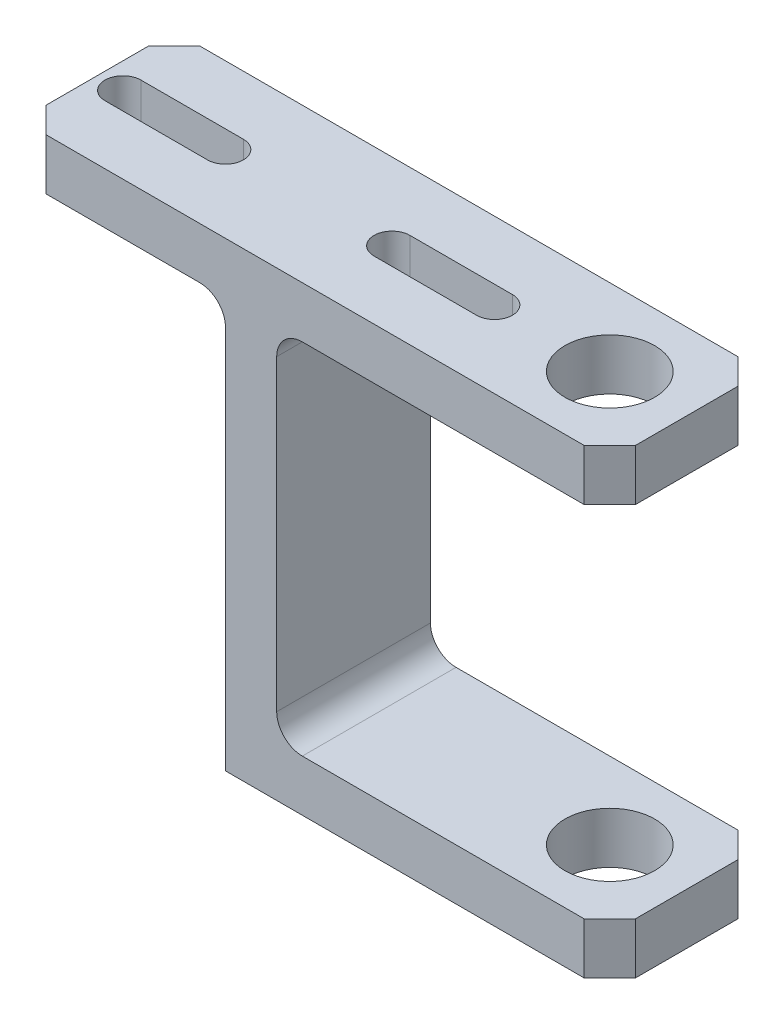
ISO-10303-21;
HEADER;
FILE_DESCRIPTION(('STEP AP214'),'2;1');
FILE_NAME('part.step','',(''),(''),'','','');
FILE_SCHEMA(('AUTOMOTIVE_DESIGN { 1 0 10303 214 1 1 1 1 }'));
ENDSEC;
DATA;
#1=APPLICATION_CONTEXT('core data for automotive mechanical design processes');
#2=APPLICATION_PROTOCOL_DEFINITION('international standard','automotive_design',2000,#1);
#3=PRODUCT_CONTEXT('',#1,'mechanical');
#4=PRODUCT('Part','Part','',(#3));
#5=PRODUCT_RELATED_PRODUCT_CATEGORY('part','',(#4));
#6=PRODUCT_DEFINITION_FORMATION('','',#4);
#7=PRODUCT_DEFINITION_CONTEXT('part definition',#1,'design');
#8=PRODUCT_DEFINITION('design','',#6,#7);
#9=PRODUCT_DEFINITION_SHAPE('','',#8);
#10=(LENGTH_UNIT() NAMED_UNIT(*) SI_UNIT(.MILLI.,.METRE.));
#11=(NAMED_UNIT(*) PLANE_ANGLE_UNIT() SI_UNIT($,.RADIAN.));
#12=(NAMED_UNIT(*) SI_UNIT($,.STERADIAN.) SOLID_ANGLE_UNIT());
#13=UNCERTAINTY_MEASURE_WITH_UNIT(LENGTH_MEASURE(1.E-05),#10,'distance_accuracy_value','');
#14=(GEOMETRIC_REPRESENTATION_CONTEXT(3) GLOBAL_UNCERTAINTY_ASSIGNED_CONTEXT((#13)) GLOBAL_UNIT_ASSIGNED_CONTEXT((#10,
#11,#12)) REPRESENTATION_CONTEXT('',''));
#15=CARTESIAN_POINT('',(0.,0.,0.));
#16=DIRECTION('',(0.,0.,1.));
#17=DIRECTION('',(1.,0.,0.));
#18=AXIS2_PLACEMENT_3D('',#15,#16,#17);
#19=CARTESIAN_POINT('',(150.,180.,30.));
#20=DIRECTION('',(0.,-1.,0.));
#21=DIRECTION('',(1.,0.,0.));
#22=AXIS2_PLACEMENT_3D('',#19,#20,#21);
#23=PLANE('',#22);
#24=DIRECTION('',(1.,0.,0.));
#25=VECTOR('',#24,1.);
#26=CARTESIAN_POINT('',(35.,180.,7.));
#27=LINE('',#26,#25);
#28=CARTESIAN_POINT('',(35.,180.,7.00000000000001));
#29=VERTEX_POINT('',#28);
#30=CARTESIAN_POINT('',(75.,180.,7.));
#31=VERTEX_POINT('',#30);
#32=EDGE_CURVE('E239',#29,#31,#27,.T.);
#33=ORIENTED_EDGE('',*,*,#32,.F.);
#34=CARTESIAN_POINT('',(35.,180.,0.));
#35=DIRECTION('',(0.,1.,0.));
#36=DIRECTION('',(-1.,0.,0.));
#37=AXIS2_PLACEMENT_3D('',#34,#35,#36);
#38=CIRCLE('',#37,7.);
#39=CARTESIAN_POINT('',(35.,180.,-6.99999999999999));
#40=VERTEX_POINT('',#39);
#41=EDGE_CURVE('E60',#40,#29,#38,.T.);
#42=ORIENTED_EDGE('',*,*,#41,.F.);
#43=DIRECTION('',(-1.,0.,0.));
#44=VECTOR('',#43,1.);
#45=CARTESIAN_POINT('',(75.,180.,-6.99999999999999));
#46=LINE('',#45,#44);
#47=CARTESIAN_POINT('',(75.,180.,-6.99999999999999));
#48=VERTEX_POINT('',#47);
#49=EDGE_CURVE('E243',#48,#40,#46,.T.);
#50=ORIENTED_EDGE('',*,*,#49,.F.);
#51=CARTESIAN_POINT('',(75.,180.,0.));
#52=DIRECTION('',(0.,-1.,0.));
#53=DIRECTION('',(1.,0.,0.));
#54=AXIS2_PLACEMENT_3D('',#51,#52,#53);
#55=CIRCLE('',#54,7.);
#56=EDGE_CURVE('E228',#48,#31,#55,.T.);
#57=ORIENTED_EDGE('',*,*,#56,.T.);
#58=EDGE_LOOP('',(#33,#42,#50,#57));
#59=FACE_BOUND('',#58,.T.);
#60=DIRECTION('',(-1.,0.,0.));
#61=VECTOR('',#60,1.);
#62=CARTESIAN_POINT('',(150.,180.,-30.));
#63=LINE('',#62,#61);
#64=CARTESIAN_POINT('',(140.,180.,-30.));
#65=VERTEX_POINT('',#64);
#66=CARTESIAN_POINT('',(-70.,180.,-30.));
#67=VERTEX_POINT('',#66);
#68=EDGE_CURVE('E529',#65,#67,#63,.T.);
#69=ORIENTED_EDGE('',*,*,#68,.T.);
#70=DIRECTION('',(0.70710678118655,0.,-0.707106781186546));
#71=VECTOR('',#70,1.);
#72=CARTESIAN_POINT('',(-80.,180.,-20.));
#73=LINE('',#72,#71);
#74=CARTESIAN_POINT('',(-80.,180.,-20.));
#75=VERTEX_POINT('',#74);
#76=EDGE_CURVE('E489',#67,#75,#73,.F.);
#77=ORIENTED_EDGE('',*,*,#76,.T.);
#78=DIRECTION('',(0.,0.,-1.));
#79=VECTOR('',#78,1.);
#80=CARTESIAN_POINT('',(-80.,180.,30.));
#81=LINE('',#80,#79);
#82=CARTESIAN_POINT('',(-80.,180.,20.));
#83=VERTEX_POINT('',#82);
#84=EDGE_CURVE('E452',#83,#75,#81,.T.);
#85=ORIENTED_EDGE('',*,*,#84,.F.);
#86=DIRECTION('',(0.707106781186546,0.,0.707106781186549));
#87=VECTOR('',#86,1.);
#88=CARTESIAN_POINT('',(-70.0000000000001,180.,30.));
#89=LINE('',#88,#87);
#90=CARTESIAN_POINT('',(-70.0000000000001,180.,30.));
#91=VERTEX_POINT('',#90);
#92=EDGE_CURVE('E488',#83,#91,#89,.T.);
#93=ORIENTED_EDGE('',*,*,#92,.T.);
#94=DIRECTION('',(-1.,0.,0.));
#95=VECTOR('',#94,1.);
#96=CARTESIAN_POINT('',(150.,180.,30.));
#97=LINE('',#96,#95);
#98=CARTESIAN_POINT('',(140.,180.,30.));
#99=VERTEX_POINT('',#98);
#100=EDGE_CURVE('E586',#99,#91,#97,.T.);
#101=ORIENTED_EDGE('',*,*,#100,.F.);
#102=DIRECTION('',(0.707106781186548,0.,-0.707106781186548));
#103=VECTOR('',#102,1.);
#104=CARTESIAN_POINT('',(140.,180.,30.));
#105=LINE('',#104,#103);
#106=CARTESIAN_POINT('',(150.,180.,20.));
#107=VERTEX_POINT('',#106);
#108=EDGE_CURVE('E463',#99,#107,#105,.T.);
#109=ORIENTED_EDGE('',*,*,#108,.T.);
#110=DIRECTION('',(0.,0.,-1.));
#111=VECTOR('',#110,1.);
#112=CARTESIAN_POINT('',(150.,180.,30.));
#113=LINE('',#112,#111);
#114=CARTESIAN_POINT('',(150.,180.,-20.));
#115=VERTEX_POINT('',#114);
#116=EDGE_CURVE('E443',#107,#115,#113,.T.);
#117=ORIENTED_EDGE('',*,*,#116,.T.);
#118=DIRECTION('',(0.707106781186549,0.,0.707106781186547));
#119=VECTOR('',#118,1.);
#120=CARTESIAN_POINT('',(150.,180.,-20.));
#121=LINE('',#120,#119);
#122=EDGE_CURVE('E486',#115,#65,#121,.F.);
#123=ORIENTED_EDGE('',*,*,#122,.T.);
#124=EDGE_LOOP('',(#69,#77,#85,#93,#101,#109,#117,#123));
#125=FACE_BOUND('',#124,.T.);
#126=CARTESIAN_POINT('',(120.,180.,0.));
#127=DIRECTION('',(0.,1.,0.));
#128=DIRECTION('',(-1.,0.,0.));
#129=AXIS2_PLACEMENT_3D('',#126,#127,#128);
#130=CIRCLE('',#129,17.5);
#131=CARTESIAN_POINT('',(102.5,180.,0.));
#132=VERTEX_POINT('',#131);
#133=EDGE_CURVE('E265',#132,#132,#130,.T.);
#134=ORIENTED_EDGE('',*,*,#133,.F.);
#135=EDGE_LOOP('',(#134));
#136=FACE_BOUND('',#135,.T.);
#137=CARTESIAN_POINT('',(-30.,180.,0.));
#138=DIRECTION('',(0.,1.,0.));
#139=DIRECTION('',(-1.,0.,0.));
#140=AXIS2_PLACEMENT_3D('',#137,#138,#139);
#141=CIRCLE('',#140,7.);
#142=CARTESIAN_POINT('',(-30.,180.,-7.));
#143=VERTEX_POINT('',#142);
#144=CARTESIAN_POINT('',(-30.,180.,7.));
#145=VERTEX_POINT('',#144);
#146=EDGE_CURVE('E263',#143,#145,#141,.F.);
#147=ORIENTED_EDGE('',*,*,#146,.T.);
#148=DIRECTION('',(1.,0.,0.));
#149=VECTOR('',#148,1.);
#150=CARTESIAN_POINT('',(0.,180.,7.));
#151=LINE('',#150,#149);
#152=CARTESIAN_POINT('',(-70.,180.,7.));
#153=VERTEX_POINT('',#152);
#154=EDGE_CURVE('E614',#153,#145,#151,.T.);
#155=ORIENTED_EDGE('',*,*,#154,.F.);
#156=CARTESIAN_POINT('',(-70.,180.,0.));
#157=DIRECTION('',(0.,1.,0.));
#158=DIRECTION('',(-1.,0.,0.));
#159=AXIS2_PLACEMENT_3D('',#156,#157,#158);
#160=CIRCLE('',#159,7.);
#161=CARTESIAN_POINT('',(-70.,180.,-6.99999999999999));
#162=VERTEX_POINT('',#161);
#163=EDGE_CURVE('E620',#162,#153,#160,.T.);
#164=ORIENTED_EDGE('',*,*,#163,.F.);
#165=DIRECTION('',(-1.,0.,0.));
#166=VECTOR('',#165,1.);
#167=CARTESIAN_POINT('',(0.,180.,-7.00000000000001));
#168=LINE('',#167,#166);
#169=EDGE_CURVE('E625',#143,#162,#168,.T.);
#170=ORIENTED_EDGE('',*,*,#169,.F.);
#171=EDGE_LOOP('',(#147,#155,#164,#170));
#172=FACE_BOUND('',#171,.T.);
#173=ADVANCED_FACE('F41',(#59,#125,#136,#172),#23,.F.);
#174=CARTESIAN_POINT('',(-80.,160.,30.));
#175=DIRECTION('',(0.,1.,0.));
#176=DIRECTION('',(0.,0.,1.));
#177=AXIS2_PLACEMENT_3D('',#174,#175,#176);
#178=PLANE('',#177);
#179=DIRECTION('',(0.,0.,-1.));
#180=VECTOR('',#179,1.);
#181=CARTESIAN_POINT('',(-80.,160.,30.));
#182=LINE('',#181,#180);
#183=CARTESIAN_POINT('',(-80.,160.,20.));
#184=VERTEX_POINT('',#183);
#185=CARTESIAN_POINT('',(-80.,160.,-20.));
#186=VERTEX_POINT('',#185);
#187=EDGE_CURVE('E455',#184,#186,#182,.T.);
#188=ORIENTED_EDGE('',*,*,#187,.T.);
#189=DIRECTION('',(-0.70710678118655,0.,0.707106781186546));
#190=VECTOR('',#189,1.);
#191=CARTESIAN_POINT('',(-80.,160.,-20.));
#192=LINE('',#191,#190);
#193=CARTESIAN_POINT('',(-70.,160.,-30.));
#194=VERTEX_POINT('',#193);
#195=EDGE_CURVE('E479',#186,#194,#192,.F.);
#196=ORIENTED_EDGE('',*,*,#195,.T.);
#197=DIRECTION('',(1.,0.,0.));
#198=VECTOR('',#197,1.);
#199=CARTESIAN_POINT('',(-80.,160.,-30.));
#200=LINE('',#199,#198);
#201=CARTESIAN_POINT('',(-10.0000000000001,160.,-30.));
#202=VERTEX_POINT('',#201);
#203=EDGE_CURVE('E570',#194,#202,#200,.T.);
#204=ORIENTED_EDGE('',*,*,#203,.T.);
#205=DIRECTION('',(0.,0.,-1.));
#206=VECTOR('',#205,1.);
#207=CARTESIAN_POINT('',(-10.0000000000001,160.,30.));
#208=LINE('',#207,#206);
#209=CARTESIAN_POINT('',(-10.0000000000001,160.,30.));
#210=VERTEX_POINT('',#209);
#211=EDGE_CURVE('E456',#210,#202,#208,.T.);
#212=ORIENTED_EDGE('',*,*,#211,.F.);
#213=DIRECTION('',(1.,0.,0.));
#214=VECTOR('',#213,1.);
#215=CARTESIAN_POINT('',(-80.,160.,30.));
#216=LINE('',#215,#214);
#217=CARTESIAN_POINT('',(-70.0000000000001,160.,30.));
#218=VERTEX_POINT('',#217);
#219=EDGE_CURVE('E582',#218,#210,#216,.T.);
#220=ORIENTED_EDGE('',*,*,#219,.F.);
#221=DIRECTION('',(-0.707106781186546,0.,-0.707106781186549));
#222=VECTOR('',#221,1.);
#223=CARTESIAN_POINT('',(-70.0000000000001,160.,30.));
#224=LINE('',#223,#222);
#225=EDGE_CURVE('E480',#218,#184,#224,.T.);
#226=ORIENTED_EDGE('',*,*,#225,.T.);
#227=EDGE_LOOP('',(#188,#196,#204,#212,#220,#226));
#228=FACE_BOUND('',#227,.T.);
#229=CARTESIAN_POINT('',(-30.,160.,0.));
#230=DIRECTION('',(0.,1.,0.));
#231=DIRECTION('',(0.,0.,1.));
#232=AXIS2_PLACEMENT_3D('',#229,#230,#231);
#233=CIRCLE('',#232,7.);
#234=CARTESIAN_POINT('',(-30.,160.,-7.));
#235=VERTEX_POINT('',#234);
#236=CARTESIAN_POINT('',(-30.,160.,7.));
#237=VERTEX_POINT('',#236);
#238=EDGE_CURVE('E423',#235,#237,#233,.F.);
#239=ORIENTED_EDGE('',*,*,#238,.F.);
#240=DIRECTION('',(-1.,0.,0.));
#241=VECTOR('',#240,1.);
#242=CARTESIAN_POINT('',(-80.,160.,-6.99999999999999));
#243=LINE('',#242,#241);
#244=CARTESIAN_POINT('',(-70.,160.,-6.99999999999999));
#245=VERTEX_POINT('',#244);
#246=EDGE_CURVE('E412',#235,#245,#243,.T.);
#247=ORIENTED_EDGE('',*,*,#246,.T.);
#248=CARTESIAN_POINT('',(-70.,160.,0.));
#249=DIRECTION('',(0.,1.,0.));
#250=DIRECTION('',(0.,0.,1.));
#251=AXIS2_PLACEMENT_3D('',#248,#249,#250);
#252=CIRCLE('',#251,7.);
#253=CARTESIAN_POINT('',(-70.,160.,7.));
#254=VERTEX_POINT('',#253);
#255=EDGE_CURVE('E415',#245,#254,#252,.T.);
#256=ORIENTED_EDGE('',*,*,#255,.T.);
#257=DIRECTION('',(1.,0.,0.));
#258=VECTOR('',#257,1.);
#259=CARTESIAN_POINT('',(-80.,160.,7.));
#260=LINE('',#259,#258);
#261=EDGE_CURVE('E416',#254,#237,#260,.T.);
#262=ORIENTED_EDGE('',*,*,#261,.T.);
#263=EDGE_LOOP('',(#239,#247,#256,#262));
#264=FACE_BOUND('',#263,.T.);
#265=ADVANCED_FACE('F339',(#228,#264),#178,.F.);
#266=CARTESIAN_POINT('',(-10.,150.,30.));
#267=DIRECTION('',(0.,0.,-1.));
#268=DIRECTION('',(-1.,0.,0.));
#269=AXIS2_PLACEMENT_3D('',#266,#267,#268);
#270=CYLINDRICAL_SURFACE('',#269,10.);
#271=CARTESIAN_POINT('',(-10.,150.,-30.));
#272=DIRECTION('',(0.,0.,1.));
#273=DIRECTION('',(1.,0.,0.));
#274=AXIS2_PLACEMENT_3D('',#271,#272,#273);
#275=CIRCLE('',#274,10.);
#276=CARTESIAN_POINT('',(0.,150.,-30.));
#277=VERTEX_POINT('',#276);
#278=EDGE_CURVE('E565',#277,#202,#275,.T.);
#279=ORIENTED_EDGE('',*,*,#278,.F.);
#280=DIRECTION('',(0.,0.,-1.));
#281=VECTOR('',#280,1.);
#282=CARTESIAN_POINT('',(0.,150.,30.));
#283=LINE('',#282,#281);
#284=CARTESIAN_POINT('',(0.,150.,30.));
#285=VERTEX_POINT('',#284);
#286=EDGE_CURVE('E466',#285,#277,#283,.T.);
#287=ORIENTED_EDGE('',*,*,#286,.F.);
#288=CARTESIAN_POINT('',(-10.,150.,30.));
#289=DIRECTION('',(0.,0.,1.));
#290=DIRECTION('',(1.,0.,0.));
#291=AXIS2_PLACEMENT_3D('',#288,#289,#290);
#292=CIRCLE('',#291,10.);
#293=EDGE_CURVE('E541',#285,#210,#292,.T.);
#294=ORIENTED_EDGE('',*,*,#293,.T.);
#295=ORIENTED_EDGE('',*,*,#211,.T.);
#296=EDGE_LOOP('',(#279,#287,#294,#295));
#297=FACE_BOUND('',#296,.T.);
#298=ADVANCED_FACE('F313',(#297),#270,.F.);
#299=CARTESIAN_POINT('',(0.,150.,30.));
#300=DIRECTION('',(1.,0.,0.));
#301=DIRECTION('',(0.,0.,-1.));
#302=AXIS2_PLACEMENT_3D('',#299,#300,#301);
#303=PLANE('',#302);
#304=DIRECTION('',(0.,-1.,0.));
#305=VECTOR('',#304,1.);
#306=CARTESIAN_POINT('',(0.,150.,-30.));
#307=LINE('',#306,#305);
#308=CARTESIAN_POINT('',(0.,0.,-30.));
#309=VERTEX_POINT('',#308);
#310=EDGE_CURVE('E537',#277,#309,#307,.T.);
#311=ORIENTED_EDGE('',*,*,#310,.T.);
#312=DIRECTION('',(0.,0.,-1.));
#313=VECTOR('',#312,1.);
#314=CARTESIAN_POINT('',(0.,0.,30.));
#315=LINE('',#314,#313);
#316=CARTESIAN_POINT('',(0.,0.,30.));
#317=VERTEX_POINT('',#316);
#318=EDGE_CURVE('E512',#317,#309,#315,.T.);
#319=ORIENTED_EDGE('',*,*,#318,.F.);
#320=DIRECTION('',(0.,-1.,0.));
#321=VECTOR('',#320,1.);
#322=CARTESIAN_POINT('',(0.,150.,30.));
#323=LINE('',#322,#321);
#324=EDGE_CURVE('E462',#285,#317,#323,.T.);
#325=ORIENTED_EDGE('',*,*,#324,.F.);
#326=ORIENTED_EDGE('',*,*,#286,.T.);
#327=EDGE_LOOP('',(#311,#319,#325,#326));
#328=FACE_BOUND('',#327,.T.);
#329=ADVANCED_FACE('F307',(#328),#303,.F.);
#330=CARTESIAN_POINT('',(0.,0.,30.));
#331=DIRECTION('',(0.,1.,0.));
#332=DIRECTION('',(0.,0.,1.));
#333=AXIS2_PLACEMENT_3D('',#330,#331,#332);
#334=PLANE('',#333);
#335=CARTESIAN_POINT('',(120.,0.,0.));
#336=DIRECTION('',(0.,1.,0.));
#337=DIRECTION('',(0.,0.,1.));
#338=AXIS2_PLACEMENT_3D('',#335,#336,#337);
#339=CIRCLE('',#338,17.5);
#340=CARTESIAN_POINT('',(120.,0.,17.5));
#341=VERTEX_POINT('',#340);
#342=EDGE_CURVE('E566',#341,#341,#339,.T.);
#343=ORIENTED_EDGE('',*,*,#342,.T.);
#344=EDGE_LOOP('',(#343));
#345=FACE_BOUND('',#344,.T.);
#346=DIRECTION('',(0.,0.,-1.));
#347=VECTOR('',#346,1.);
#348=CARTESIAN_POINT('',(150.,0.,30.));
#349=LINE('',#348,#347);
#350=CARTESIAN_POINT('',(150.,0.,20.));
#351=VERTEX_POINT('',#350);
#352=CARTESIAN_POINT('',(150.,0.,-20.));
#353=VERTEX_POINT('',#352);
#354=EDGE_CURVE('E503',#351,#353,#349,.T.);
#355=ORIENTED_EDGE('',*,*,#354,.F.);
#356=DIRECTION('',(-0.707106781186548,0.,0.707106781186548));
#357=VECTOR('',#356,1.);
#358=CARTESIAN_POINT('',(140.,0.,30.));
#359=LINE('',#358,#357);
#360=CARTESIAN_POINT('',(140.,0.,30.));
#361=VERTEX_POINT('',#360);
#362=EDGE_CURVE('E400',#351,#361,#359,.T.);
#363=ORIENTED_EDGE('',*,*,#362,.T.);
#364=DIRECTION('',(1.,0.,0.));
#365=VECTOR('',#364,1.);
#366=CARTESIAN_POINT('',(0.,0.,30.));
#367=LINE('',#366,#365);
#368=EDGE_CURVE('E550',#317,#361,#367,.T.);
#369=ORIENTED_EDGE('',*,*,#368,.F.);
#370=ORIENTED_EDGE('',*,*,#318,.T.);
#371=DIRECTION('',(1.,0.,0.));
#372=VECTOR('',#371,1.);
#373=CARTESIAN_POINT('',(0.,0.,-30.));
#374=LINE('',#373,#372);
#375=CARTESIAN_POINT('',(140.,0.,-30.));
#376=VERTEX_POINT('',#375);
#377=EDGE_CURVE('E540',#309,#376,#374,.T.);
#378=ORIENTED_EDGE('',*,*,#377,.T.);
#379=DIRECTION('',(-0.707106781186549,0.,-0.707106781186547));
#380=VECTOR('',#379,1.);
#381=CARTESIAN_POINT('',(150.,0.,-20.));
#382=LINE('',#381,#380);
#383=EDGE_CURVE('E395',#376,#353,#382,.F.);
#384=ORIENTED_EDGE('',*,*,#383,.T.);
#385=EDGE_LOOP('',(#355,#363,#369,#370,#378,#384));
#386=FACE_BOUND('',#385,.T.);
#387=ADVANCED_FACE('F309',(#345,#386),#334,.F.);
#388=CARTESIAN_POINT('',(150.,0.,30.));
#389=DIRECTION('',(-1.,0.,0.));
#390=DIRECTION('',(0.,0.,1.));
#391=AXIS2_PLACEMENT_3D('',#388,#389,#390);
#392=PLANE('',#391);
#393=DIRECTION('',(0.,0.,-1.));
#394=VECTOR('',#393,1.);
#395=CARTESIAN_POINT('',(150.,20.,30.));
#396=LINE('',#395,#394);
#397=CARTESIAN_POINT('',(150.,20.,20.));
#398=VERTEX_POINT('',#397);
#399=CARTESIAN_POINT('',(150.,20.,-20.));
#400=VERTEX_POINT('',#399);
#401=EDGE_CURVE('E504',#398,#400,#396,.T.);
#402=ORIENTED_EDGE('',*,*,#401,.F.);
#403=DIRECTION('',(0.,-1.,0.));
#404=VECTOR('',#403,1.);
#405=CARTESIAN_POINT('',(150.,0.,20.));
#406=LINE('',#405,#404);
#407=EDGE_CURVE('E402',#398,#351,#406,.T.);
#408=ORIENTED_EDGE('',*,*,#407,.T.);
#409=ORIENTED_EDGE('',*,*,#354,.T.);
#410=DIRECTION('',(0.,1.,0.));
#411=VECTOR('',#410,1.);
#412=CARTESIAN_POINT('',(150.,0.,-20.));
#413=LINE('',#412,#411);
#414=EDGE_CURVE('E393',#353,#400,#413,.T.);
#415=ORIENTED_EDGE('',*,*,#414,.T.);
#416=EDGE_LOOP('',(#402,#408,#409,#415));
#417=FACE_BOUND('',#416,.T.);
#418=ADVANCED_FACE('F312',(#417),#392,.F.);
#419=CARTESIAN_POINT('',(150.,20.,30.));
#420=DIRECTION('',(0.,-1.,0.));
#421=DIRECTION('',(1.,0.,0.));
#422=AXIS2_PLACEMENT_3D('',#419,#420,#421);
#423=PLANE('',#422);
#424=CARTESIAN_POINT('',(120.,20.,0.));
#425=DIRECTION('',(0.,-1.,0.));
#426=DIRECTION('',(1.,0.,0.));
#427=AXIS2_PLACEMENT_3D('',#424,#425,#426);
#428=CIRCLE('',#427,17.5);
#429=CARTESIAN_POINT('',(137.5,20.,0.));
#430=VERTEX_POINT('',#429);
#431=EDGE_CURVE('E599',#430,#430,#428,.T.);
#432=ORIENTED_EDGE('',*,*,#431,.T.);
#433=EDGE_LOOP('',(#432));
#434=FACE_BOUND('',#433,.T.);
#435=DIRECTION('',(-1.,0.,0.));
#436=VECTOR('',#435,1.);
#437=CARTESIAN_POINT('',(150.,20.,30.));
#438=LINE('',#437,#436);
#439=CARTESIAN_POINT('',(140.,20.,30.));
#440=VERTEX_POINT('',#439);
#441=CARTESIAN_POINT('',(30.0000000000001,20.,30.));
#442=VERTEX_POINT('',#441);
#443=EDGE_CURVE('E557',#440,#442,#438,.T.);
#444=ORIENTED_EDGE('',*,*,#443,.F.);
#445=DIRECTION('',(0.707106781186548,0.,-0.707106781186548));
#446=VECTOR('',#445,1.);
#447=CARTESIAN_POINT('',(140.,20.,30.));
#448=LINE('',#447,#446);
#449=EDGE_CURVE('E498',#440,#398,#448,.T.);
#450=ORIENTED_EDGE('',*,*,#449,.T.);
#451=ORIENTED_EDGE('',*,*,#401,.T.);
#452=DIRECTION('',(0.707106781186549,0.,0.707106781186547));
#453=VECTOR('',#452,1.);
#454=CARTESIAN_POINT('',(150.,20.,-20.));
#455=LINE('',#454,#453);
#456=CARTESIAN_POINT('',(140.,20.,-30.));
#457=VERTEX_POINT('',#456);
#458=EDGE_CURVE('E499',#400,#457,#455,.F.);
#459=ORIENTED_EDGE('',*,*,#458,.T.);
#460=DIRECTION('',(-1.,0.,0.));
#461=VECTOR('',#460,1.);
#462=CARTESIAN_POINT('',(150.,20.,-30.));
#463=LINE('',#462,#461);
#464=CARTESIAN_POINT('',(30.0000000000001,20.,-30.));
#465=VERTEX_POINT('',#464);
#466=EDGE_CURVE('E532',#457,#465,#463,.T.);
#467=ORIENTED_EDGE('',*,*,#466,.T.);
#468=DIRECTION('',(0.,0.,-1.));
#469=VECTOR('',#468,1.);
#470=CARTESIAN_POINT('',(30.0000000000001,20.,30.));
#471=LINE('',#470,#469);
#472=EDGE_CURVE('E508',#442,#465,#471,.T.);
#473=ORIENTED_EDGE('',*,*,#472,.F.);
#474=EDGE_LOOP('',(#444,#450,#451,#459,#467,#473));
#475=FACE_BOUND('',#474,.T.);
#476=ADVANCED_FACE('F317',(#434,#475),#423,.F.);
#477=CARTESIAN_POINT('',(30.,30.,30.));
#478=DIRECTION('',(0.,0.,-1.));
#479=DIRECTION('',(-1.,0.,0.));
#480=AXIS2_PLACEMENT_3D('',#477,#478,#479);
#481=CYLINDRICAL_SURFACE('',#480,10.);
#482=CARTESIAN_POINT('',(30.,30.,-30.));
#483=DIRECTION('',(0.,0.,1.));
#484=DIRECTION('',(1.,0.,0.));
#485=AXIS2_PLACEMENT_3D('',#482,#483,#484);
#486=CIRCLE('',#485,10.);
#487=CARTESIAN_POINT('',(20.,30.0000000000001,-30.));
#488=VERTEX_POINT('',#487);
#489=EDGE_CURVE('E525',#488,#465,#486,.T.);
#490=ORIENTED_EDGE('',*,*,#489,.F.);
#491=DIRECTION('',(0.,0.,-1.));
#492=VECTOR('',#491,1.);
#493=CARTESIAN_POINT('',(20.,30.0000000000001,30.));
#494=LINE('',#493,#492);
#495=CARTESIAN_POINT('',(20.,30.0000000000001,30.));
#496=VERTEX_POINT('',#495);
#497=EDGE_CURVE('E514',#496,#488,#494,.T.);
#498=ORIENTED_EDGE('',*,*,#497,.F.);
#499=CARTESIAN_POINT('',(30.,30.,30.));
#500=DIRECTION('',(0.,0.,1.));
#501=DIRECTION('',(1.,0.,0.));
#502=AXIS2_PLACEMENT_3D('',#499,#500,#501);
#503=CIRCLE('',#502,10.);
#504=EDGE_CURVE('E553',#496,#442,#503,.T.);
#505=ORIENTED_EDGE('',*,*,#504,.T.);
#506=ORIENTED_EDGE('',*,*,#472,.T.);
#507=EDGE_LOOP('',(#490,#498,#505,#506));
#508=FACE_BOUND('',#507,.T.);
#509=ADVANCED_FACE('F323',(#508),#481,.F.);
#510=CARTESIAN_POINT('',(20.,30.0000000000001,30.));
#511=DIRECTION('',(-1.,0.,0.));
#512=DIRECTION('',(0.,-1.,0.));
#513=AXIS2_PLACEMENT_3D('',#510,#511,#512);
#514=PLANE('',#513);
#515=DIRECTION('',(0.,1.,0.));
#516=VECTOR('',#515,1.);
#517=CARTESIAN_POINT('',(20.,30.0000000000001,-30.));
#518=LINE('',#517,#516);
#519=CARTESIAN_POINT('',(20.,150.,-30.));
#520=VERTEX_POINT('',#519);
#521=EDGE_CURVE('E522',#488,#520,#518,.T.);
#522=ORIENTED_EDGE('',*,*,#521,.T.);
#523=DIRECTION('',(0.,0.,-1.));
#524=VECTOR('',#523,1.);
#525=CARTESIAN_POINT('',(20.,150.,30.));
#526=LINE('',#525,#524);
#527=CARTESIAN_POINT('',(20.,150.,30.));
#528=VERTEX_POINT('',#527);
#529=EDGE_CURVE('E444',#528,#520,#526,.T.);
#530=ORIENTED_EDGE('',*,*,#529,.F.);
#531=DIRECTION('',(0.,1.,0.));
#532=VECTOR('',#531,1.);
#533=CARTESIAN_POINT('',(20.,30.0000000000001,30.));
#534=LINE('',#533,#532);
#535=EDGE_CURVE('E560',#496,#528,#534,.T.);
#536=ORIENTED_EDGE('',*,*,#535,.F.);
#537=ORIENTED_EDGE('',*,*,#497,.T.);
#538=EDGE_LOOP('',(#522,#530,#536,#537));
#539=FACE_BOUND('',#538,.T.);
#540=ADVANCED_FACE('F326',(#539),#514,.F.);
#541=CARTESIAN_POINT('',(30.,150.,30.));
#542=DIRECTION('',(0.,0.,-1.));
#543=DIRECTION('',(-1.,0.,0.));
#544=AXIS2_PLACEMENT_3D('',#541,#542,#543);
#545=CYLINDRICAL_SURFACE('',#544,10.);
#546=CARTESIAN_POINT('',(30.0000000000001,160.,4.89897948556643));
#547=CARTESIAN_POINT('',(29.8628771150602,159.99999564988,4.75906144843114));
#548=CARTESIAN_POINT('',(29.7316886022272,159.997179190797,4.61338560174572));
#549=CARTESIAN_POINT('',(29.4820695450036,159.987360427946,4.3116906867217));
#550=CARTESIAN_POINT('',(29.3636348048478,159.980359505789,4.15567504744624));
#551=CARTESIAN_POINT('',(29.1403696064977,159.963611944259,3.83444919495911));
#552=CARTESIAN_POINT('',(29.0355332364488,159.953866503943,3.66924302224498));
#553=CARTESIAN_POINT('',(28.8400762096787,159.932987565615,3.33069652724332));
#554=CARTESIAN_POINT('',(28.7494565142071,159.921853973837,3.15735565596287));
#555=CARTESIAN_POINT('',(28.5830645408297,159.899461726095,2.80376648519749));
#556=CARTESIAN_POINT('',(28.5072874127998,159.88820311226,2.62352046521213));
#557=CARTESIAN_POINT('',(28.3710559630115,159.866676283218,2.2572712161597));
#558=CARTESIAN_POINT('',(28.3106014357436,159.856408054729,2.0712680643459));
#559=CARTESIAN_POINT('',(28.2054677108086,159.837810025858,1.69484515057826));
#560=CARTESIAN_POINT('',(28.1607816622993,159.829479384201,1.5044273450502));
#561=CARTESIAN_POINT('',(28.0874855328184,159.815481826327,1.12042405324736));
#562=CARTESIAN_POINT('',(28.0588753608379,159.80981489503,0.926838584911792));
#563=CARTESIAN_POINT('',(28.017912174224,159.801620645662,0.537454704692379));
#564=CARTESIAN_POINT('',(28.0055951607822,159.7991002809,0.341652353236444));
#565=CARTESIAN_POINT('',(27.9974365793033,159.797436268489,-0.0503114344761204));
#566=CARTESIAN_POINT('',(28.0015951315339,159.79829264549,-0.246472873343553));
#567=CARTESIAN_POINT('',(28.0263581176131,159.803310467728,-0.637783649184409));
#568=CARTESIAN_POINT('',(28.0469686199866,159.807473132531,-0.832932585943242));
#569=CARTESIAN_POINT('',(28.1044755838711,159.818749588279,-1.22072326670541));
#570=CARTESIAN_POINT('',(28.1413717232771,159.825863320855,-1.41336506021864));
#571=CARTESIAN_POINT('',(28.2305502181669,159.842310212107,-1.79217631701491));
#572=CARTESIAN_POINT('',(28.2826160323684,159.851611802456,-1.97839820773038));
#573=CARTESIAN_POINT('',(28.4019420293899,159.871669992267,-2.34583652108023));
#574=CARTESIAN_POINT('',(28.4692031233238,159.882426678962,-2.52705264283557));
#575=CARTESIAN_POINT('',(28.6184167998854,159.904388180901,-2.88316369111347));
#576=CARTESIAN_POINT('',(28.7003593074965,159.915592684763,-3.05806285431968));
#577=CARTESIAN_POINT('',(28.8783936876739,159.937305414603,-3.40046815794813));
#578=CARTESIAN_POINT('',(28.97448211459,159.947813809237,-3.56797608584303));
#579=CARTESIAN_POINT('',(29.2098189567037,159.96961858497,-3.94150438064138));
#580=CARTESIAN_POINT('',(29.3535402404695,159.98027584067,-4.14478352726641));
#581=CARTESIAN_POINT('',(29.5846588718374,159.991668141442,-4.43728931347061));
#582=CARTESIAN_POINT('',(29.6642581183472,159.994699726615,-4.53269204248666));
#583=CARTESIAN_POINT('',(29.8284419833835,159.998865408568,-4.71915365701487));
#584=CARTESIAN_POINT('',(29.9130267450704,159.999999450831,-4.81021241765278));
#585=CARTESIAN_POINT('',(30.0000000000001,160.,-4.89897948556643));
#586=B_SPLINE_CURVE_WITH_KNOTS('',3,(#546,#547,#548,#549,#550,#551,#552,#553,#554,#555,#556,
#557,#558,#559,#560,#561,#562,#563,#564,#565,#566,#567,#568,#569,#570,#571,#572,#573,#574,#575,
#576,#577,#578,#579,#580,#581,#582,#583,#584,#585),.UNSPECIFIED.,.F.,.F.,(4,2,2,2,2,2,2,2,2,2,2,
2,2,2,2,2,2,2,2,4),(0.,0.587471530871944,1.17474919974625,1.76177068933847,2.34883185285333,
2.93570086045229,3.52256199643986,4.10916784733233,4.69577037728868,5.28366690490183,
5.87156772402521,6.45968549860083,7.04779164162327,7.62788287713042,8.20800890433027,
8.78773833841839,9.36732679546514,10.1132252552327,10.4859207388048,10.8586269296516),.UNSPECIFIED.);
#587=CARTESIAN_POINT('',(30.0000000000001,160.,4.89897948556644));
#588=VERTEX_POINT('',#587);
#589=CARTESIAN_POINT('',(30.0000000000001,160.,-4.89897948556644));
#590=VERTEX_POINT('',#589);
#591=EDGE_CURVE('E252',#588,#590,#586,.T.);
#592=ORIENTED_EDGE('',*,*,#591,.F.);
#593=DIRECTION('',(0.,0.,-1.));
#594=VECTOR('',#593,1.);
#595=CARTESIAN_POINT('',(30.0000000000001,160.,30.));
#596=LINE('',#595,#594);
#597=CARTESIAN_POINT('',(30.0000000000001,160.,30.));
#598=VERTEX_POINT('',#597);
#599=EDGE_CURVE('E431',#598,#588,#596,.T.);
#600=ORIENTED_EDGE('',*,*,#599,.F.);
#601=CARTESIAN_POINT('',(30.,150.,30.));
#602=DIRECTION('',(0.,0.,1.));
#603=DIRECTION('',(1.,0.,0.));
#604=AXIS2_PLACEMENT_3D('',#601,#602,#603);
#605=CIRCLE('',#604,10.);
#606=EDGE_CURVE('E521',#598,#528,#605,.T.);
#607=ORIENTED_EDGE('',*,*,#606,.T.);
#608=ORIENTED_EDGE('',*,*,#529,.T.);
#609=CARTESIAN_POINT('',(30.,150.,-30.));
#610=DIRECTION('',(0.,0.,1.));
#611=DIRECTION('',(1.,0.,0.));
#612=AXIS2_PLACEMENT_3D('',#609,#610,#611);
#613=CIRCLE('',#612,10.);
#614=CARTESIAN_POINT('',(30.0000000000001,160.,-30.));
#615=VERTEX_POINT('',#614);
#616=EDGE_CURVE('E437',#615,#520,#613,.T.);
#617=ORIENTED_EDGE('',*,*,#616,.F.);
#618=EDGE_CURVE('E436',#590,#615,#596,.T.);
#619=ORIENTED_EDGE('',*,*,#618,.F.);
#620=EDGE_LOOP('',(#592,#600,#607,#608,#617,#619));
#621=FACE_BOUND('',#620,.T.);
#622=ADVANCED_FACE('F264',(#621),#545,.F.);
#623=CARTESIAN_POINT('',(30.0000000000001,160.,30.));
#624=DIRECTION('',(0.,1.,0.));
#625=DIRECTION('',(0.,0.,1.));
#626=AXIS2_PLACEMENT_3D('',#623,#624,#625);
#627=PLANE('',#626);
#628=CARTESIAN_POINT('',(120.,160.,0.));
#629=DIRECTION('',(0.,1.,0.));
#630=DIRECTION('',(0.,0.,1.));
#631=AXIS2_PLACEMENT_3D('',#628,#629,#630);
#632=CIRCLE('',#631,17.5);
#633=CARTESIAN_POINT('',(120.,160.,17.5));
#634=VERTEX_POINT('',#633);
#635=EDGE_CURVE('E602',#634,#634,#632,.T.);
#636=ORIENTED_EDGE('',*,*,#635,.T.);
#637=EDGE_LOOP('',(#636));
#638=FACE_BOUND('',#637,.T.);
#639=DIRECTION('',(-1.,0.,0.));
#640=VECTOR('',#639,1.);
#641=CARTESIAN_POINT('',(30.0000000000001,160.,-6.99999999999999));
#642=LINE('',#641,#640);
#643=CARTESIAN_POINT('',(75.,160.,-6.99999999999999));
#644=VERTEX_POINT('',#643);
#645=CARTESIAN_POINT('',(35.,160.,-6.99999999999999));
#646=VERTEX_POINT('',#645);
#647=EDGE_CURVE('E422',#644,#646,#642,.T.);
#648=ORIENTED_EDGE('',*,*,#647,.T.);
#649=CARTESIAN_POINT('',(35.,160.,0.));
#650=DIRECTION('',(0.,1.,0.));
#651=DIRECTION('',(0.,0.,1.));
#652=AXIS2_PLACEMENT_3D('',#649,#650,#651);
#653=CIRCLE('',#652,7.);
#654=EDGE_CURVE('E11',#646,#590,#653,.T.);
#655=ORIENTED_EDGE('',*,*,#654,.T.);
#656=ORIENTED_EDGE('',*,*,#618,.T.);
#657=DIRECTION('',(1.,0.,0.));
#658=VECTOR('',#657,1.);
#659=CARTESIAN_POINT('',(30.0000000000001,160.,-30.));
#660=LINE('',#659,#658);
#661=CARTESIAN_POINT('',(140.,160.,-30.));
#662=VERTEX_POINT('',#661);
#663=EDGE_CURVE('E526',#615,#662,#660,.T.);
#664=ORIENTED_EDGE('',*,*,#663,.T.);
#665=DIRECTION('',(-0.707106781186549,0.,-0.707106781186547));
#666=VECTOR('',#665,1.);
#667=CARTESIAN_POINT('',(150.,160.,-20.));
#668=LINE('',#667,#666);
#669=CARTESIAN_POINT('',(150.,160.,-20.));
#670=VERTEX_POINT('',#669);
#671=EDGE_CURVE('E408',#662,#670,#668,.F.);
#672=ORIENTED_EDGE('',*,*,#671,.T.);
#673=DIRECTION('',(0.,0.,-1.));
#674=VECTOR('',#673,1.);
#675=CARTESIAN_POINT('',(150.,160.,30.));
#676=LINE('',#675,#674);
#677=CARTESIAN_POINT('',(150.,160.,20.));
#678=VERTEX_POINT('',#677);
#679=EDGE_CURVE('E442',#678,#670,#676,.T.);
#680=ORIENTED_EDGE('',*,*,#679,.F.);
#681=DIRECTION('',(-0.707106781186548,0.,0.707106781186548));
#682=VECTOR('',#681,1.);
#683=CARTESIAN_POINT('',(140.,160.,30.));
#684=LINE('',#683,#682);
#685=CARTESIAN_POINT('',(140.,160.,30.));
#686=VERTEX_POINT('',#685);
#687=EDGE_CURVE('E470',#678,#686,#684,.T.);
#688=ORIENTED_EDGE('',*,*,#687,.T.);
#689=DIRECTION('',(1.,0.,0.));
#690=VECTOR('',#689,1.);
#691=CARTESIAN_POINT('',(30.0000000000001,160.,30.));
#692=LINE('',#691,#690);
#693=EDGE_CURVE('E591',#598,#686,#692,.T.);
#694=ORIENTED_EDGE('',*,*,#693,.F.);
#695=ORIENTED_EDGE('',*,*,#599,.T.);
#696=CARTESIAN_POINT('',(35.,160.,7.));
#697=VERTEX_POINT('',#696);
#698=EDGE_CURVE('E46',#588,#697,#653,.T.);
#699=ORIENTED_EDGE('',*,*,#698,.T.);
#700=DIRECTION('',(1.,0.,0.));
#701=VECTOR('',#700,1.);
#702=CARTESIAN_POINT('',(30.0000000000001,160.,7.00000000000001));
#703=LINE('',#702,#701);
#704=CARTESIAN_POINT('',(75.,160.,7.));
#705=VERTEX_POINT('',#704);
#706=EDGE_CURVE('E421',#697,#705,#703,.T.);
#707=ORIENTED_EDGE('',*,*,#706,.T.);
#708=CARTESIAN_POINT('',(75.,160.,0.));
#709=DIRECTION('',(0.,1.,0.));
#710=DIRECTION('',(0.,0.,1.));
#711=AXIS2_PLACEMENT_3D('',#708,#709,#710);
#712=CIRCLE('',#711,7.);
#713=EDGE_CURVE('E234',#644,#705,#712,.F.);
#714=ORIENTED_EDGE('',*,*,#713,.F.);
#715=EDGE_LOOP('',(#648,#655,#656,#664,#672,#680,#688,#694,#695,#699,#707,#714));
#716=FACE_BOUND('',#715,.T.);
#717=ADVANCED_FACE('F331',(#638,#716),#627,.F.);
#718=CARTESIAN_POINT('',(150.,160.,30.));
#719=DIRECTION('',(-1.,0.,0.));
#720=DIRECTION('',(0.,0.,1.));
#721=AXIS2_PLACEMENT_3D('',#718,#719,#720);
#722=PLANE('',#721);
#723=ORIENTED_EDGE('',*,*,#679,.T.);
#724=DIRECTION('',(0.,1.,0.));
#725=VECTOR('',#724,1.);
#726=CARTESIAN_POINT('',(150.,160.,-20.));
#727=LINE('',#726,#725);
#728=EDGE_CURVE('E401',#670,#115,#727,.T.);
#729=ORIENTED_EDGE('',*,*,#728,.T.);
#730=ORIENTED_EDGE('',*,*,#116,.F.);
#731=DIRECTION('',(0.,-1.,0.));
#732=VECTOR('',#731,1.);
#733=CARTESIAN_POINT('',(150.,160.,20.));
#734=LINE('',#733,#732);
#735=EDGE_CURVE('E469',#107,#678,#734,.T.);
#736=ORIENTED_EDGE('',*,*,#735,.T.);
#737=EDGE_LOOP('',(#723,#729,#730,#736));
#738=FACE_BOUND('',#737,.T.);
#739=ADVANCED_FACE('F350',(#738),#722,.F.);
#740=CARTESIAN_POINT('',(-80.,180.,30.));
#741=DIRECTION('',(1.,0.,0.));
#742=DIRECTION('',(0.,0.,-1.));
#743=AXIS2_PLACEMENT_3D('',#740,#741,#742);
#744=PLANE('',#743);
#745=ORIENTED_EDGE('',*,*,#84,.T.);
#746=DIRECTION('',(0.,-1.,0.));
#747=VECTOR('',#746,1.);
#748=CARTESIAN_POINT('',(-80.,180.,-20.));
#749=LINE('',#748,#747);
#750=EDGE_CURVE('E475',#75,#186,#749,.T.);
#751=ORIENTED_EDGE('',*,*,#750,.T.);
#752=ORIENTED_EDGE('',*,*,#187,.F.);
#753=DIRECTION('',(0.,1.,0.));
#754=VECTOR('',#753,1.);
#755=CARTESIAN_POINT('',(-80.,180.,20.));
#756=LINE('',#755,#754);
#757=EDGE_CURVE('E472',#184,#83,#756,.T.);
#758=ORIENTED_EDGE('',*,*,#757,.T.);
#759=EDGE_LOOP('',(#745,#751,#752,#758));
#760=FACE_BOUND('',#759,.T.);
#761=ADVANCED_FACE('F301',(#760),#744,.F.);
#762=CARTESIAN_POINT('',(-10.,150.,30.));
#763=DIRECTION('',(0.,0.,1.));
#764=DIRECTION('',(1.,0.,0.));
#765=AXIS2_PLACEMENT_3D('',#762,#763,#764);
#766=PLANE('',#765);
#767=ORIENTED_EDGE('',*,*,#100,.T.);
#768=DIRECTION('',(0.,-1.,0.));
#769=VECTOR('',#768,1.);
#770=CARTESIAN_POINT('',(-70.0000000000001,160.,30.));
#771=LINE('',#770,#769);
#772=EDGE_CURVE('E494',#91,#218,#771,.T.);
#773=ORIENTED_EDGE('',*,*,#772,.T.);
#774=ORIENTED_EDGE('',*,*,#219,.T.);
#775=ORIENTED_EDGE('',*,*,#293,.F.);
#776=ORIENTED_EDGE('',*,*,#324,.T.);
#777=ORIENTED_EDGE('',*,*,#368,.T.);
#778=DIRECTION('',(0.,1.,0.));
#779=VECTOR('',#778,1.);
#780=CARTESIAN_POINT('',(140.,20.,30.));
#781=LINE('',#780,#779);
#782=EDGE_CURVE('E495',#361,#440,#781,.T.);
#783=ORIENTED_EDGE('',*,*,#782,.T.);
#784=ORIENTED_EDGE('',*,*,#443,.T.);
#785=ORIENTED_EDGE('',*,*,#504,.F.);
#786=ORIENTED_EDGE('',*,*,#535,.T.);
#787=ORIENTED_EDGE('',*,*,#606,.F.);
#788=ORIENTED_EDGE('',*,*,#693,.T.);
#789=DIRECTION('',(0.,1.,0.));
#790=VECTOR('',#789,1.);
#791=CARTESIAN_POINT('',(140.,180.,30.));
#792=LINE('',#791,#790);
#793=EDGE_CURVE('E465',#686,#99,#792,.T.);
#794=ORIENTED_EDGE('',*,*,#793,.T.);
#795=EDGE_LOOP('',(#767,#773,#774,#775,#776,#777,#783,#784,#785,#786,#787,#788,#794));
#796=FACE_BOUND('',#795,.T.);
#797=ADVANCED_FACE('F300',(#796),#766,.T.);
#798=CARTESIAN_POINT('',(-10.,150.,-30.));
#799=DIRECTION('',(0.,0.,1.));
#800=DIRECTION('',(1.,0.,0.));
#801=AXIS2_PLACEMENT_3D('',#798,#799,#800);
#802=PLANE('',#801);
#803=ORIENTED_EDGE('',*,*,#203,.F.);
#804=DIRECTION('',(0.,1.,0.));
#805=VECTOR('',#804,1.);
#806=CARTESIAN_POINT('',(-70.,150.,-30.));
#807=LINE('',#806,#805);
#808=EDGE_CURVE('E482',#194,#67,#807,.T.);
#809=ORIENTED_EDGE('',*,*,#808,.T.);
#810=ORIENTED_EDGE('',*,*,#68,.F.);
#811=DIRECTION('',(0.,-1.,0.));
#812=VECTOR('',#811,1.);
#813=CARTESIAN_POINT('',(140.,150.,-30.));
#814=LINE('',#813,#812);
#815=EDGE_CURVE('E481',#65,#662,#814,.T.);
#816=ORIENTED_EDGE('',*,*,#815,.T.);
#817=ORIENTED_EDGE('',*,*,#663,.F.);
#818=ORIENTED_EDGE('',*,*,#616,.T.);
#819=ORIENTED_EDGE('',*,*,#521,.F.);
#820=ORIENTED_EDGE('',*,*,#489,.T.);
#821=ORIENTED_EDGE('',*,*,#466,.F.);
#822=DIRECTION('',(0.,-1.,0.));
#823=VECTOR('',#822,1.);
#824=CARTESIAN_POINT('',(140.,150.,-30.));
#825=LINE('',#824,#823);
#826=EDGE_CURVE('E394',#457,#376,#825,.T.);
#827=ORIENTED_EDGE('',*,*,#826,.T.);
#828=ORIENTED_EDGE('',*,*,#377,.F.);
#829=ORIENTED_EDGE('',*,*,#310,.F.);
#830=ORIENTED_EDGE('',*,*,#278,.T.);
#831=EDGE_LOOP('',(#803,#809,#810,#816,#817,#818,#819,#820,#821,#827,#828,#829,#830));
#832=FACE_BOUND('',#831,.T.);
#833=ADVANCED_FACE('F298',(#832),#802,.F.);
#834=CARTESIAN_POINT('',(140.,150.,30.));
#835=DIRECTION('',(0.707106781186547,0.,0.707106781186547));
#836=DIRECTION('',(0.,-1.,0.));
#837=AXIS2_PLACEMENT_3D('',#834,#835,#836);
#838=PLANE('',#837);
#839=ORIENTED_EDGE('',*,*,#687,.F.);
#840=ORIENTED_EDGE('',*,*,#735,.F.);
#841=ORIENTED_EDGE('',*,*,#108,.F.);
#842=ORIENTED_EDGE('',*,*,#793,.F.);
#843=EDGE_LOOP('',(#839,#840,#841,#842));
#844=FACE_BOUND('',#843,.T.);
#845=ADVANCED_FACE('F305',(#844),#838,.T.);
#846=CARTESIAN_POINT('',(-80.,180.,-20.));
#847=DIRECTION('',(0.707106781186545,0.,0.707106781186549));
#848=DIRECTION('',(0.,-1.,0.));
#849=AXIS2_PLACEMENT_3D('',#846,#847,#848);
#850=PLANE('',#849);
#851=ORIENTED_EDGE('',*,*,#76,.F.);
#852=ORIENTED_EDGE('',*,*,#808,.F.);
#853=ORIENTED_EDGE('',*,*,#195,.F.);
#854=ORIENTED_EDGE('',*,*,#750,.F.);
#855=EDGE_LOOP('',(#851,#852,#853,#854));
#856=FACE_BOUND('',#855,.T.);
#857=ADVANCED_FACE('F358',(#856),#850,.F.);
#858=CARTESIAN_POINT('',(-70.0000000000001,150.,30.));
#859=DIRECTION('',(-0.707106781186549,0.,0.707106781186546));
#860=DIRECTION('',(0.,1.,0.));
#861=AXIS2_PLACEMENT_3D('',#858,#859,#860);
#862=PLANE('',#861);
#863=ORIENTED_EDGE('',*,*,#92,.F.);
#864=ORIENTED_EDGE('',*,*,#757,.F.);
#865=ORIENTED_EDGE('',*,*,#225,.F.);
#866=ORIENTED_EDGE('',*,*,#772,.F.);
#867=EDGE_LOOP('',(#863,#864,#865,#866));
#868=FACE_BOUND('',#867,.T.);
#869=ADVANCED_FACE('F368',(#868),#862,.T.);
#870=CARTESIAN_POINT('',(140.,150.,30.));
#871=DIRECTION('',(0.707106781186547,0.,0.707106781186547));
#872=DIRECTION('',(0.,-1.,0.));
#873=AXIS2_PLACEMENT_3D('',#870,#871,#872);
#874=PLANE('',#873);
#875=ORIENTED_EDGE('',*,*,#362,.F.);
#876=ORIENTED_EDGE('',*,*,#407,.F.);
#877=ORIENTED_EDGE('',*,*,#449,.F.);
#878=ORIENTED_EDGE('',*,*,#782,.F.);
#879=EDGE_LOOP('',(#875,#876,#877,#878));
#880=FACE_BOUND('',#879,.T.);
#881=ADVANCED_FACE('F373',(#880),#874,.T.);
#882=CARTESIAN_POINT('',(150.,0.,-20.));
#883=DIRECTION('',(-0.707106781186546,0.,0.707106781186548));
#884=DIRECTION('',(0.,1.,0.));
#885=AXIS2_PLACEMENT_3D('',#882,#883,#884);
#886=PLANE('',#885);
#887=ORIENTED_EDGE('',*,*,#383,.F.);
#888=ORIENTED_EDGE('',*,*,#826,.F.);
#889=ORIENTED_EDGE('',*,*,#458,.F.);
#890=ORIENTED_EDGE('',*,*,#414,.F.);
#891=EDGE_LOOP('',(#887,#888,#889,#890));
#892=FACE_BOUND('',#891,.T.);
#893=ADVANCED_FACE('F377',(#892),#886,.F.);
#894=CARTESIAN_POINT('',(150.,160.,-20.));
#895=DIRECTION('',(-0.707106781186546,0.,0.707106781186548));
#896=DIRECTION('',(0.,1.,0.));
#897=AXIS2_PLACEMENT_3D('',#894,#895,#896);
#898=PLANE('',#897);
#899=ORIENTED_EDGE('',*,*,#671,.F.);
#900=ORIENTED_EDGE('',*,*,#815,.F.);
#901=ORIENTED_EDGE('',*,*,#122,.F.);
#902=ORIENTED_EDGE('',*,*,#728,.F.);
#903=EDGE_LOOP('',(#899,#900,#901,#902));
#904=FACE_BOUND('',#903,.T.);
#905=ADVANCED_FACE('F42',(#904),#898,.F.);
#906=CARTESIAN_POINT('',(-30.,-32.0000000000001,0.));
#907=DIRECTION('',(0.,1.,0.));
#908=DIRECTION('',(-1.,0.,0.));
#909=AXIS2_PLACEMENT_3D('',#906,#907,#908);
#910=CYLINDRICAL_SURFACE('',#909,7.);
#911=ORIENTED_EDGE('',*,*,#238,.T.);
#912=DIRECTION('',(0.,1.,0.));
#913=VECTOR('',#912,1.);
#914=CARTESIAN_POINT('',(-30.,-32.0000000000001,7.));
#915=LINE('',#914,#913);
#916=EDGE_CURVE('E607',#237,#145,#915,.T.);
#917=ORIENTED_EDGE('',*,*,#916,.T.);
#918=ORIENTED_EDGE('',*,*,#146,.F.);
#919=DIRECTION('',(0.,1.,0.));
#920=VECTOR('',#919,1.);
#921=CARTESIAN_POINT('',(-30.,-32.0000000000001,-7.));
#922=LINE('',#921,#920);
#923=EDGE_CURVE('E606',#235,#143,#922,.T.);
#924=ORIENTED_EDGE('',*,*,#923,.F.);
#925=EDGE_LOOP('',(#911,#917,#918,#924));
#926=FACE_BOUND('',#925,.T.);
#927=ADVANCED_FACE('F282',(#926),#910,.F.);
#928=CARTESIAN_POINT('',(0.,-32.0000000000001,7.));
#929=DIRECTION('',(0.,0.,1.));
#930=DIRECTION('',(1.,0.,0.));
#931=AXIS2_PLACEMENT_3D('',#928,#929,#930);
#932=PLANE('',#931);
#933=DIRECTION('',(0.,1.,0.));
#934=VECTOR('',#933,1.);
#935=CARTESIAN_POINT('',(-70.,-32.0000000000001,7.));
#936=LINE('',#935,#934);
#937=EDGE_CURVE('E613',#254,#153,#936,.T.);
#938=ORIENTED_EDGE('',*,*,#937,.T.);
#939=ORIENTED_EDGE('',*,*,#154,.T.);
#940=ORIENTED_EDGE('',*,*,#916,.F.);
#941=ORIENTED_EDGE('',*,*,#261,.F.);
#942=EDGE_LOOP('',(#938,#939,#940,#941));
#943=FACE_BOUND('',#942,.T.);
#944=ADVANCED_FACE('F280',(#943),#932,.F.);
#945=CARTESIAN_POINT('',(-70.,-32.0000000000001,0.));
#946=DIRECTION('',(0.,1.,0.));
#947=DIRECTION('',(-1.,0.,0.));
#948=AXIS2_PLACEMENT_3D('',#945,#946,#947);
#949=CYLINDRICAL_SURFACE('',#948,7.);
#950=DIRECTION('',(0.,1.,0.));
#951=VECTOR('',#950,1.);
#952=CARTESIAN_POINT('',(-70.,-32.0000000000001,-6.99999999999999));
#953=LINE('',#952,#951);
#954=EDGE_CURVE('E615',#245,#162,#953,.T.);
#955=ORIENTED_EDGE('',*,*,#954,.T.);
#956=ORIENTED_EDGE('',*,*,#163,.T.);
#957=ORIENTED_EDGE('',*,*,#937,.F.);
#958=ORIENTED_EDGE('',*,*,#255,.F.);
#959=EDGE_LOOP('',(#955,#956,#957,#958));
#960=FACE_BOUND('',#959,.T.);
#961=ADVANCED_FACE('F278',(#960),#949,.F.);
#962=CARTESIAN_POINT('',(0.,-32.0000000000001,-7.00000000000001));
#963=DIRECTION('',(0.,0.,-1.));
#964=DIRECTION('',(-1.,0.,0.));
#965=AXIS2_PLACEMENT_3D('',#962,#963,#964);
#966=PLANE('',#965);
#967=ORIENTED_EDGE('',*,*,#923,.T.);
#968=ORIENTED_EDGE('',*,*,#169,.T.);
#969=ORIENTED_EDGE('',*,*,#954,.F.);
#970=ORIENTED_EDGE('',*,*,#246,.F.);
#971=EDGE_LOOP('',(#967,#968,#969,#970));
#972=FACE_BOUND('',#971,.T.);
#973=ADVANCED_FACE('F283',(#972),#966,.F.);
#974=CARTESIAN_POINT('',(120.,-32.0000000000001,0.));
#975=DIRECTION('',(0.,1.,0.));
#976=DIRECTION('',(-1.,0.,0.));
#977=AXIS2_PLACEMENT_3D('',#974,#975,#976);
#978=CYLINDRICAL_SURFACE('',#977,17.5);
#979=ORIENTED_EDGE('',*,*,#133,.T.);
#980=EDGE_LOOP('',(#979));
#981=FACE_BOUND('',#980,.T.);
#982=ORIENTED_EDGE('',*,*,#635,.F.);
#983=EDGE_LOOP('',(#982));
#984=FACE_BOUND('',#983,.T.);
#985=ADVANCED_FACE('F288',(#981,#984),#978,.F.);
#986=ORIENTED_EDGE('',*,*,#431,.F.);
#987=EDGE_LOOP('',(#986));
#988=FACE_BOUND('',#987,.T.);
#989=ORIENTED_EDGE('',*,*,#342,.F.);
#990=EDGE_LOOP('',(#989));
#991=FACE_BOUND('',#990,.T.);
#992=ADVANCED_FACE('F274',(#988,#991),#978,.F.);
#993=CARTESIAN_POINT('',(35.,69.,0.));
#994=DIRECTION('',(0.,1.,0.));
#995=DIRECTION('',(-1.,0.,0.));
#996=AXIS2_PLACEMENT_3D('',#993,#994,#995);
#997=CYLINDRICAL_SURFACE('',#996,7.);
#998=DIRECTION('',(0.,1.,0.));
#999=VECTOR('',#998,1.);
#1000=CARTESIAN_POINT('',(35.,69.,-6.99999999999999));
#1001=LINE('',#1000,#999);
#1002=EDGE_CURVE('E250',#646,#40,#1001,.T.);
#1003=ORIENTED_EDGE('',*,*,#1002,.T.);
#1004=ORIENTED_EDGE('',*,*,#41,.T.);
#1005=DIRECTION('',(0.,1.,0.));
#1006=VECTOR('',#1005,1.);
#1007=CARTESIAN_POINT('',(35.,69.,7.));
#1008=LINE('',#1007,#1006);
#1009=EDGE_CURVE('E237',#697,#29,#1008,.T.);
#1010=ORIENTED_EDGE('',*,*,#1009,.F.);
#1011=ORIENTED_EDGE('',*,*,#698,.F.);
#1012=ORIENTED_EDGE('',*,*,#591,.T.);
#1013=ORIENTED_EDGE('',*,*,#654,.F.);
#1014=EDGE_LOOP('',(#1003,#1004,#1010,#1011,#1012,#1013));
#1015=FACE_BOUND('',#1014,.T.);
#1016=ADVANCED_FACE('F267',(#1015),#997,.F.);
#1017=CARTESIAN_POINT('',(75.,69.,-6.99999999999999));
#1018=DIRECTION('',(0.,0.,-1.));
#1019=DIRECTION('',(-1.,0.,0.));
#1020=AXIS2_PLACEMENT_3D('',#1017,#1018,#1019);
#1021=PLANE('',#1020);
#1022=DIRECTION('',(0.,1.,0.));
#1023=VECTOR('',#1022,1.);
#1024=CARTESIAN_POINT('',(75.,69.,-6.99999999999999));
#1025=LINE('',#1024,#1023);
#1026=EDGE_CURVE('E235',#644,#48,#1025,.T.);
#1027=ORIENTED_EDGE('',*,*,#1026,.T.);
#1028=ORIENTED_EDGE('',*,*,#49,.T.);
#1029=ORIENTED_EDGE('',*,*,#1002,.F.);
#1030=ORIENTED_EDGE('',*,*,#647,.F.);
#1031=EDGE_LOOP('',(#1027,#1028,#1029,#1030));
#1032=FACE_BOUND('',#1031,.T.);
#1033=ADVANCED_FACE('F273',(#1032),#1021,.F.);
#1034=CARTESIAN_POINT('',(75.,69.,0.));
#1035=DIRECTION('',(0.,1.,0.));
#1036=DIRECTION('',(-1.,0.,0.));
#1037=AXIS2_PLACEMENT_3D('',#1034,#1035,#1036);
#1038=CYLINDRICAL_SURFACE('',#1037,7.);
#1039=ORIENTED_EDGE('',*,*,#713,.T.);
#1040=DIRECTION('',(0.,1.,0.));
#1041=VECTOR('',#1040,1.);
#1042=CARTESIAN_POINT('',(75.,69.,7.));
#1043=LINE('',#1042,#1041);
#1044=EDGE_CURVE('E63',#705,#31,#1043,.T.);
#1045=ORIENTED_EDGE('',*,*,#1044,.T.);
#1046=ORIENTED_EDGE('',*,*,#56,.F.);
#1047=ORIENTED_EDGE('',*,*,#1026,.F.);
#1048=EDGE_LOOP('',(#1039,#1045,#1046,#1047));
#1049=FACE_BOUND('',#1048,.T.);
#1050=ADVANCED_FACE('F230',(#1049),#1038,.F.);
#1051=CARTESIAN_POINT('',(35.,69.,7.));
#1052=DIRECTION('',(0.,0.,1.));
#1053=DIRECTION('',(1.,0.,0.));
#1054=AXIS2_PLACEMENT_3D('',#1051,#1052,#1053);
#1055=PLANE('',#1054);
#1056=ORIENTED_EDGE('',*,*,#1009,.T.);
#1057=ORIENTED_EDGE('',*,*,#32,.T.);
#1058=ORIENTED_EDGE('',*,*,#1044,.F.);
#1059=ORIENTED_EDGE('',*,*,#706,.F.);
#1060=EDGE_LOOP('',(#1056,#1057,#1058,#1059));
#1061=FACE_BOUND('',#1060,.T.);
#1062=ADVANCED_FACE('F238',(#1061),#1055,.F.);
#1063=CLOSED_SHELL('',(#173,#265,#298,#329,#387,#418,#476,#509,#540,#622,#717,#739,#761,#797,
#833,#845,#857,#869,#881,#893,#905,#927,#944,#961,#973,#985,#992,#1016,#1033,#1050,#1062));
#1064=MANIFOLD_SOLID_BREP('B2',#1063);
#1065=ADVANCED_BREP_SHAPE_REPRESENTATION('',(#18,#1064),#14);
#1066=SHAPE_DEFINITION_REPRESENTATION(#9,#1065);
ENDSEC;
END-ISO-10303-21;
